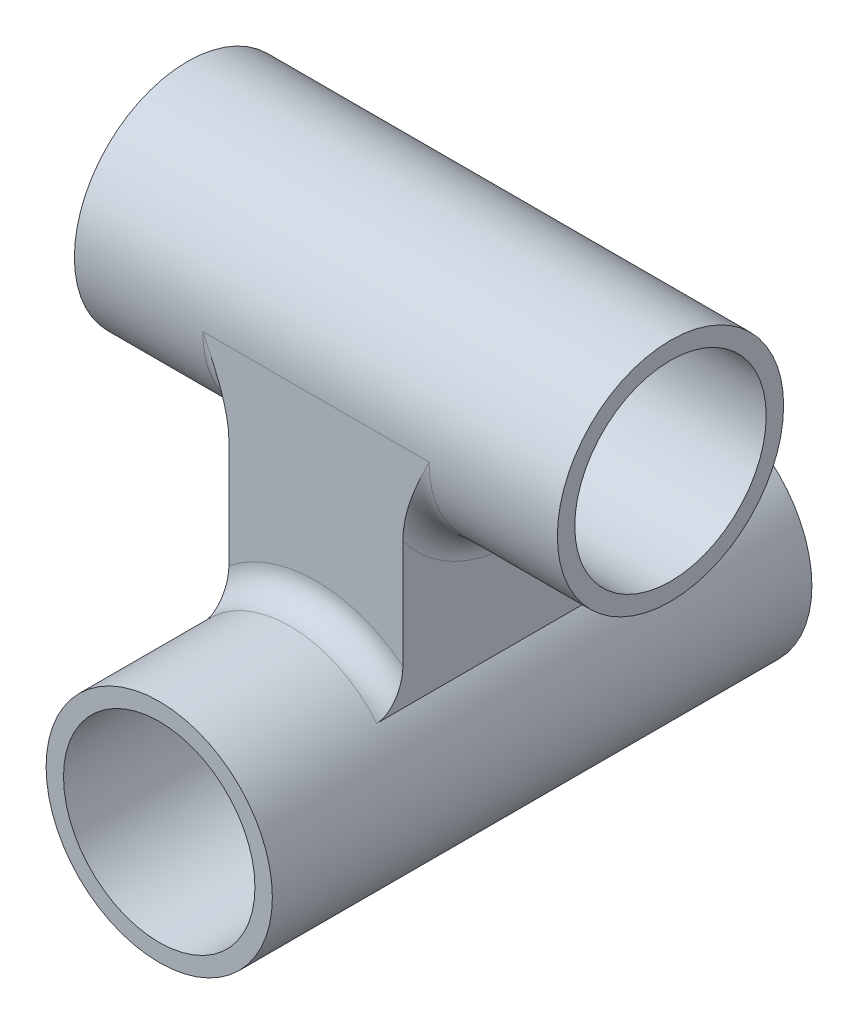
ISO-10303-21;
HEADER;
FILE_DESCRIPTION(('STEP AP214'),'2;1');
FILE_NAME('part.step','',(''),(''),'','','');
FILE_SCHEMA(('AUTOMOTIVE_DESIGN { 1 0 10303 214 1 1 1 1 }'));
ENDSEC;
DATA;
#1=APPLICATION_CONTEXT('core data for automotive mechanical design processes');
#2=APPLICATION_PROTOCOL_DEFINITION('international standard','automotive_design',2000,#1);
#3=PRODUCT_CONTEXT('',#1,'mechanical');
#4=PRODUCT('Part','Part','',(#3));
#5=PRODUCT_RELATED_PRODUCT_CATEGORY('part','',(#4));
#6=PRODUCT_DEFINITION_FORMATION('','',#4);
#7=PRODUCT_DEFINITION_CONTEXT('part definition',#1,'design');
#8=PRODUCT_DEFINITION('design','',#6,#7);
#9=PRODUCT_DEFINITION_SHAPE('','',#8);
#10=(LENGTH_UNIT() NAMED_UNIT(*) SI_UNIT(.MILLI.,.METRE.));
#11=(NAMED_UNIT(*) PLANE_ANGLE_UNIT() SI_UNIT($,.RADIAN.));
#12=(NAMED_UNIT(*) SI_UNIT($,.STERADIAN.) SOLID_ANGLE_UNIT());
#13=UNCERTAINTY_MEASURE_WITH_UNIT(LENGTH_MEASURE(1.E-05),#10,'distance_accuracy_value','');
#14=(GEOMETRIC_REPRESENTATION_CONTEXT(3) GLOBAL_UNCERTAINTY_ASSIGNED_CONTEXT((#13)) GLOBAL_UNIT_ASSIGNED_CONTEXT((#10,
#11,#12)) REPRESENTATION_CONTEXT('',''));
#15=CARTESIAN_POINT('',(0.,0.,0.));
#16=DIRECTION('',(0.,0.,1.));
#17=DIRECTION('',(1.,0.,0.));
#18=AXIS2_PLACEMENT_3D('',#15,#16,#17);
#19=CARTESIAN_POINT('',(0.,0.,31.));
#20=DIRECTION('',(0.,0.,1.));
#21=DIRECTION('',(1.,0.,0.));
#22=AXIS2_PLACEMENT_3D('',#19,#20,#21);
#23=PLANE('',#22);
#24=CARTESIAN_POINT('',(0.,0.,31.));
#25=DIRECTION('',(0.,0.,1.));
#26=DIRECTION('',(1.,0.,0.));
#27=AXIS2_PLACEMENT_3D('',#24,#25,#26);
#28=CIRCLE('',#27,13.);
#29=CARTESIAN_POINT('',(13.,0.,31.));
#30=VERTEX_POINT('',#29);
#31=EDGE_CURVE('E132',#30,#30,#28,.T.);
#32=ORIENTED_EDGE('',*,*,#31,.T.);
#33=EDGE_LOOP('',(#32));
#34=FACE_BOUND('',#33,.T.);
#35=CARTESIAN_POINT('',(0.,0.,31.));
#36=DIRECTION('',(0.,0.,1.));
#37=DIRECTION('',(1.,0.,0.));
#38=AXIS2_PLACEMENT_3D('',#35,#36,#37);
#39=CIRCLE('',#38,11.);
#40=CARTESIAN_POINT('',(11.,0.,31.));
#41=VERTEX_POINT('',#40);
#42=EDGE_CURVE('E227',#41,#41,#39,.T.);
#43=ORIENTED_EDGE('',*,*,#42,.F.);
#44=EDGE_LOOP('',(#43));
#45=FACE_BOUND('',#44,.T.);
#46=ADVANCED_FACE('F39',(#34,#45),#23,.T.);
#47=CARTESIAN_POINT('',(0.,0.,-31.));
#48=DIRECTION('',(0.,0.,1.));
#49=DIRECTION('',(1.,0.,0.));
#50=AXIS2_PLACEMENT_3D('',#47,#48,#49);
#51=PLANE('',#50);
#52=CARTESIAN_POINT('',(0.,0.,-31.));
#53=DIRECTION('',(0.,0.,1.));
#54=DIRECTION('',(1.,0.,0.));
#55=AXIS2_PLACEMENT_3D('',#52,#53,#54);
#56=CIRCLE('',#55,13.);
#57=CARTESIAN_POINT('',(13.,0.,-31.));
#58=VERTEX_POINT('',#57);
#59=EDGE_CURVE('E233',#58,#58,#56,.T.);
#60=ORIENTED_EDGE('',*,*,#59,.F.);
#61=EDGE_LOOP('',(#60));
#62=FACE_BOUND('',#61,.T.);
#63=CARTESIAN_POINT('',(0.,0.,-31.));
#64=DIRECTION('',(0.,0.,1.));
#65=DIRECTION('',(1.,0.,0.));
#66=AXIS2_PLACEMENT_3D('',#63,#64,#65);
#67=CIRCLE('',#66,11.);
#68=CARTESIAN_POINT('',(11.,0.,-31.));
#69=VERTEX_POINT('',#68);
#70=EDGE_CURVE('E230',#69,#69,#67,.T.);
#71=ORIENTED_EDGE('',*,*,#70,.T.);
#72=EDGE_LOOP('',(#71));
#73=FACE_BOUND('',#72,.T.);
#74=ADVANCED_FACE('F202',(#62,#73),#51,.F.);
#75=CARTESIAN_POINT('',(0.,0.,31.));
#76=DIRECTION('',(0.,0.,-1.));
#77=DIRECTION('',(-1.,0.,0.));
#78=AXIS2_PLACEMENT_3D('',#75,#76,#77);
#79=CYLINDRICAL_SURFACE('',#78,13.);
#80=CARTESIAN_POINT('',(0.,0.,-16.));
#81=DIRECTION('',(0.,0.,1.));
#82=DIRECTION('',(1.,0.,0.));
#83=AXIS2_PLACEMENT_3D('',#80,#81,#82);
#84=CIRCLE('',#83,13.);
#85=CARTESIAN_POINT('',(-10.,8.30662386291807,-16.));
#86=VERTEX_POINT('',#85);
#87=CARTESIAN_POINT('',(10.,8.30662386291807,-16.));
#88=VERTEX_POINT('',#87);
#89=EDGE_CURVE('E131',#86,#88,#84,.F.);
#90=ORIENTED_EDGE('',*,*,#89,.T.);
#91=DIRECTION('',(0.,0.,-1.));
#92=VECTOR('',#91,1.);
#93=CARTESIAN_POINT('',(10.,8.30662386291807,13.));
#94=LINE('',#93,#92);
#95=CARTESIAN_POINT('',(10.,8.30662386291807,16.));
#96=VERTEX_POINT('',#95);
#97=EDGE_CURVE('E122',#96,#88,#94,.T.);
#98=ORIENTED_EDGE('',*,*,#97,.F.);
#99=CARTESIAN_POINT('',(0.,0.,16.));
#100=DIRECTION('',(0.,0.,1.));
#101=DIRECTION('',(1.,0.,0.));
#102=AXIS2_PLACEMENT_3D('',#99,#100,#101);
#103=CIRCLE('',#102,13.);
#104=CARTESIAN_POINT('',(-10.,8.30662386291807,16.));
#105=VERTEX_POINT('',#104);
#106=EDGE_CURVE('E126',#96,#105,#103,.T.);
#107=ORIENTED_EDGE('',*,*,#106,.T.);
#108=DIRECTION('',(0.,0.,-1.));
#109=VECTOR('',#108,1.);
#110=CARTESIAN_POINT('',(-10.,8.30662386291807,13.));
#111=LINE('',#110,#109);
#112=EDGE_CURVE('E109',#105,#86,#111,.T.);
#113=ORIENTED_EDGE('',*,*,#112,.T.);
#114=EDGE_LOOP('',(#90,#98,#107,#113));
#115=FACE_BOUND('',#114,.T.);
#116=ORIENTED_EDGE('',*,*,#31,.F.);
#117=EDGE_LOOP('',(#116));
#118=FACE_BOUND('',#117,.T.);
#119=ORIENTED_EDGE('',*,*,#59,.T.);
#120=EDGE_LOOP('',(#119));
#121=FACE_BOUND('',#120,.T.);
#122=ADVANCED_FACE('F127',(#115,#118,#121),#79,.T.);
#123=CARTESIAN_POINT('',(0.,0.,31.));
#124=DIRECTION('',(0.,0.,-1.));
#125=DIRECTION('',(-1.,0.,0.));
#126=AXIS2_PLACEMENT_3D('',#123,#124,#125);
#127=CYLINDRICAL_SURFACE('',#126,11.);
#128=ORIENTED_EDGE('',*,*,#42,.T.);
#129=EDGE_LOOP('',(#128));
#130=FACE_BOUND('',#129,.T.);
#131=ORIENTED_EDGE('',*,*,#70,.F.);
#132=EDGE_LOOP('',(#131));
#133=FACE_BOUND('',#132,.T.);
#134=ADVANCED_FACE('F213',(#130,#133),#127,.F.);
#135=CARTESIAN_POINT('',(10.,8.30662386291807,13.));
#136=DIRECTION('',(-1.,0.,0.));
#137=DIRECTION('',(0.,0.,1.));
#138=AXIS2_PLACEMENT_3D('',#135,#136,#137);
#139=PLANE('',#138);
#140=DIRECTION('',(0.,1.,0.));
#141=VECTOR('',#140,1.);
#142=CARTESIAN_POINT('',(10.,8.30662386291807,-13.));
#143=LINE('',#142,#141);
#144=CARTESIAN_POINT('',(10.,12.4899959967968,-13.));
#145=VERTEX_POINT('',#144);
#146=CARTESIAN_POINT('',(10.,24.9792448098293,-13.));
#147=VERTEX_POINT('',#146);
#148=EDGE_CURVE('E269',#145,#147,#143,.T.);
#149=ORIENTED_EDGE('',*,*,#148,.T.);
#150=CARTESIAN_POINT('',(10.,34.3066238629181,0.));
#151=DIRECTION('',(-1.,0.,0.));
#152=DIRECTION('',(0.,0.,1.));
#153=AXIS2_PLACEMENT_3D('',#150,#151,#152);
#154=CIRCLE('',#153,16.);
#155=CARTESIAN_POINT('',(10.,24.9792448098293,13.));
#156=VERTEX_POINT('',#155);
#157=EDGE_CURVE('E252',#147,#156,#154,.T.);
#158=ORIENTED_EDGE('',*,*,#157,.T.);
#159=DIRECTION('',(0.,1.,0.));
#160=VECTOR('',#159,1.);
#161=CARTESIAN_POINT('',(10.,8.30662386291807,13.));
#162=LINE('',#161,#160);
#163=CARTESIAN_POINT('',(10.,12.4899959967968,13.));
#164=VERTEX_POINT('',#163);
#165=EDGE_CURVE('E305',#164,#156,#162,.T.);
#166=ORIENTED_EDGE('',*,*,#165,.F.);
#167=CARTESIAN_POINT('',(10.,12.4899959967968,13.));
#168=CARTESIAN_POINT('',(10.,12.3635305072587,13.000008460085));
#169=CARTESIAN_POINT('',(10.,12.2370869478931,13.0048730253736));
#170=CARTESIAN_POINT('',(10.,11.9849450710262,13.0240193173672));
#171=CARTESIAN_POINT('',(10.,11.8592465673436,13.0382985818873));
#172=CARTESIAN_POINT('',(10.,11.6083760404319,13.0761081414322));
#173=CARTESIAN_POINT('',(10.,11.4832134680354,13.0997009196541));
#174=CARTESIAN_POINT('',(10.,11.2349185572668,13.155911915837));
#175=CARTESIAN_POINT('',(10.,11.1117864935054,13.1885313441471));
#176=CARTESIAN_POINT('',(10.,10.8510274412971,13.2678716909599));
#177=CARTESIAN_POINT('',(10.,10.7138055871928,13.3159326380406));
#178=CARTESIAN_POINT('',(10.,10.4438854764759,13.4235280956361));
#179=CARTESIAN_POINT('',(10.,10.3111884877645,13.4830657914298));
#180=CARTESIAN_POINT('',(10.,10.0518784691725,13.6135380451328));
#181=CARTESIAN_POINT('',(10.,9.92525198282513,13.6844457224775));
#182=CARTESIAN_POINT('',(10.,9.67939200814812,13.8379629665378));
#183=CARTESIAN_POINT('',(10.,9.56015342874513,13.9205643431285));
#184=CARTESIAN_POINT('',(10.,9.31240681177737,14.1123421336292));
#185=CARTESIAN_POINT('',(10.,9.18553011330381,14.223655888137));
#186=CARTESIAN_POINT('',(10.,8.94913693815627,14.4634593249828));
#187=CARTESIAN_POINT('',(10.,8.83959706389628,14.591925419208));
#188=CARTESIAN_POINT('',(10.,8.66657652854176,14.8354242881711));
#189=CARTESIAN_POINT('',(10.,8.59827599149694,14.9470040891866));
#190=CARTESIAN_POINT('',(10.,8.48063155375902,15.1795494276318));
#191=CARTESIAN_POINT('',(10.,8.43122815878752,15.3004840430228));
#192=CARTESIAN_POINT('',(10.,8.36522062311841,15.517770792605));
#193=CARTESIAN_POINT('',(10.,8.34346975155049,15.6125501079397));
#194=CARTESIAN_POINT('',(10.,8.32148047074597,15.7565975376567));
#195=CARTESIAN_POINT('',(10.,8.3159229976145,15.8050883552907));
#196=CARTESIAN_POINT('',(10.,8.30848961281239,15.9023803358274));
#197=CARTESIAN_POINT('',(10.,8.30661594319214,15.9511816696042));
#198=CARTESIAN_POINT('',(10.,8.30662386291807,16.));
#199=B_SPLINE_CURVE_WITH_KNOTS('',3,(#167,#168,#169,#170,#171,#172,#173,#174,#175,#176,#177,
#178,#179,#180,#181,#182,#183,#184,#185,#186,#187,#188,#189,#190,#191,#192,#193,#194,#195,#196,
#197,#198),.UNSPECIFIED.,.F.,.F.,(4,2,2,2,2,2,2,2,2,2,2,2,2,2,2,4),(0.,0.379271737736314,
0.758444325520817,1.14020518704317,1.52201726224596,1.95768239209769,2.39346861184106,
2.82823935070601,3.26270707424575,3.76761319809666,4.27183198623569,4.66292170527858,
5.05276981010725,5.34344276053081,5.48974072117135,5.63612769469873),.UNSPECIFIED.);
#200=EDGE_CURVE('E139',#164,#96,#199,.T.);
#201=ORIENTED_EDGE('',*,*,#200,.T.);
#202=ORIENTED_EDGE('',*,*,#97,.T.);
#203=CARTESIAN_POINT('',(10.,8.30662386291807,-16.));
#204=CARTESIAN_POINT('',(10.,8.30658833886969,-15.9347323725916));
#205=CARTESIAN_POINT('',(10.,8.30995593729337,-15.8694862288077));
#206=CARTESIAN_POINT('',(10.,8.32322059180652,-15.7397463602789));
#207=CARTESIAN_POINT('',(10.,8.33310886107564,-15.6752517416852));
#208=CARTESIAN_POINT('',(10.,8.35898486301592,-15.5483037774158));
#209=CARTESIAN_POINT('',(10.,8.37489876713847,-15.4858352861301));
#210=CARTESIAN_POINT('',(10.,8.41237545008858,-15.3626217868488));
#211=CARTESIAN_POINT('',(10.,8.43393978929203,-15.3018772600721));
#212=CARTESIAN_POINT('',(10.,8.50608473879607,-15.1234508266238));
#213=CARTESIAN_POINT('',(10.,8.56428759848339,-15.0087912835817));
#214=CARTESIAN_POINT('',(10.,8.69692062773018,-14.7890668517077));
#215=CARTESIAN_POINT('',(10.,8.77140572882401,-14.6840361930419));
#216=CARTESIAN_POINT('',(10.,8.97850133343871,-14.4276257083442));
#217=CARTESIAN_POINT('',(10.,9.12019339495249,-14.283536379677));
#218=CARTESIAN_POINT('',(10.,9.34803940291859,-14.0855004351729));
#219=CARTESIAN_POINT('',(10.,9.42667381912647,-14.0224207566723));
#220=CARTESIAN_POINT('',(10.,9.58829324073127,-13.9020998332437));
#221=CARTESIAN_POINT('',(10.,9.67127707189939,-13.8448570246801));
#222=CARTESIAN_POINT('',(10.,9.87272062149177,-13.7156582275456));
#223=CARTESIAN_POINT('',(10.,9.99280997458357,-13.646239017307));
#224=CARTESIAN_POINT('',(10.,10.2384715129593,-13.517926051586));
#225=CARTESIAN_POINT('',(10.,10.3640458239996,-13.4590364228141));
#226=CARTESIAN_POINT('',(10.,10.7472170190388,-13.2980469542637));
#227=CARTESIAN_POINT('',(10.,11.0115394870172,-13.2114528302501));
#228=CARTESIAN_POINT('',(10.,11.4789347528081,-13.0981074821472));
#229=CARTESIAN_POINT('',(10.,11.6797290076567,-13.0615882805379));
#230=CARTESIAN_POINT('',(10.,11.9827806630126,-13.0248091682262));
#231=CARTESIAN_POINT('',(10.,12.083978024326,-13.0155498004726));
#232=CARTESIAN_POINT('',(10.,12.2867749350851,-13.0031460840651));
#233=CARTESIAN_POINT('',(10.,12.3883745927901,-13.0000035119592));
#234=CARTESIAN_POINT('',(10.,12.4899959967968,-13.));
#235=B_SPLINE_CURVE_WITH_KNOTS('',3,(#203,#204,#205,#206,#207,#208,#209,#210,#211,#212,#213,
#214,#215,#216,#217,#218,#219,#220,#221,#222,#223,#224,#225,#226,#227,#228,#229,#230,#231,#232,
#233,#234),.UNSPECIFIED.,.F.,.F.,(4,2,2,2,2,2,2,2,2,2,2,2,2,2,2,4),(0.,0.195681446554637,
0.391099743230843,0.584197354457684,0.777348346172959,1.1612746100636,1.54651668863445,
2.14915059614874,2.45141027621394,2.75358877019722,3.16913184582677,3.58483742412144,
4.41527844334981,5.02620512378388,5.33089429985237,5.63567195594355),.UNSPECIFIED.);
#236=EDGE_CURVE('E256',#88,#145,#235,.T.);
#237=ORIENTED_EDGE('',*,*,#236,.T.);
#238=EDGE_LOOP('',(#149,#158,#166,#201,#202,#237));
#239=FACE_BOUND('',#238,.T.);
#240=ADVANCED_FACE('F218',(#239),#139,.F.);
#241=CARTESIAN_POINT('',(-10.,8.30662386291807,13.));
#242=DIRECTION('',(1.,0.,0.));
#243=DIRECTION('',(0.,0.,-1.));
#244=AXIS2_PLACEMENT_3D('',#241,#242,#243);
#245=PLANE('',#244);
#246=DIRECTION('',(0.,-1.,0.));
#247=VECTOR('',#246,1.);
#248=CARTESIAN_POINT('',(-10.,8.30662386291807,13.));
#249=LINE('',#248,#247);
#250=CARTESIAN_POINT('',(-10.,24.9792448098293,13.));
#251=VERTEX_POINT('',#250);
#252=CARTESIAN_POINT('',(-10.,12.4899959967968,13.));
#253=VERTEX_POINT('',#252);
#254=EDGE_CURVE('E123',#251,#253,#249,.T.);
#255=ORIENTED_EDGE('',*,*,#254,.F.);
#256=CARTESIAN_POINT('',(-10.,34.3066238629181,0.));
#257=DIRECTION('',(1.,0.,0.));
#258=DIRECTION('',(0.,0.,-1.));
#259=AXIS2_PLACEMENT_3D('',#256,#257,#258);
#260=CIRCLE('',#259,16.);
#261=CARTESIAN_POINT('',(-10.,24.9792448098293,-13.));
#262=VERTEX_POINT('',#261);
#263=EDGE_CURVE('E254',#251,#262,#260,.T.);
#264=ORIENTED_EDGE('',*,*,#263,.T.);
#265=DIRECTION('',(0.,-1.,0.));
#266=VECTOR('',#265,1.);
#267=CARTESIAN_POINT('',(-10.,8.30662386291807,-13.));
#268=LINE('',#267,#266);
#269=CARTESIAN_POINT('',(-10.,12.4899959967968,-13.));
#270=VERTEX_POINT('',#269);
#271=EDGE_CURVE('E308',#262,#270,#268,.T.);
#272=ORIENTED_EDGE('',*,*,#271,.T.);
#273=CARTESIAN_POINT('',(-10.,12.4899959967968,-13.));
#274=CARTESIAN_POINT('',(-10.,12.3635305072587,-13.000008460085));
#275=CARTESIAN_POINT('',(-10.,12.2370869478931,-13.0048730253736));
#276=CARTESIAN_POINT('',(-10.,11.9849450710262,-13.0240193173672));
#277=CARTESIAN_POINT('',(-10.,11.8592465673436,-13.0382985818873));
#278=CARTESIAN_POINT('',(-10.,11.6083760404319,-13.0761081414322));
#279=CARTESIAN_POINT('',(-10.,11.4832134680354,-13.0997009196541));
#280=CARTESIAN_POINT('',(-10.,11.2349185572668,-13.155911915837));
#281=CARTESIAN_POINT('',(-10.,11.1117864935054,-13.1885313441471));
#282=CARTESIAN_POINT('',(-10.,10.8510274412971,-13.2678716909599));
#283=CARTESIAN_POINT('',(-10.,10.7138055871928,-13.3159326380406));
#284=CARTESIAN_POINT('',(-10.,10.4438854764759,-13.4235280956361));
#285=CARTESIAN_POINT('',(-10.,10.3111884877645,-13.4830657914298));
#286=CARTESIAN_POINT('',(-10.,10.0518784691725,-13.6135380451328));
#287=CARTESIAN_POINT('',(-10.,9.92525198282513,-13.6844457224775));
#288=CARTESIAN_POINT('',(-10.,9.67939200814812,-13.8379629665378));
#289=CARTESIAN_POINT('',(-10.,9.56015342874513,-13.9205643431285));
#290=CARTESIAN_POINT('',(-10.,9.31240681177737,-14.1123421336292));
#291=CARTESIAN_POINT('',(-10.,9.18553011330381,-14.223655888137));
#292=CARTESIAN_POINT('',(-10.,8.94913693815627,-14.4634593249828));
#293=CARTESIAN_POINT('',(-10.,8.83959706389628,-14.591925419208));
#294=CARTESIAN_POINT('',(-10.,8.66657652854176,-14.8354242881711));
#295=CARTESIAN_POINT('',(-10.,8.59827599149694,-14.9470040891866));
#296=CARTESIAN_POINT('',(-10.,8.48063155375902,-15.1795494276318));
#297=CARTESIAN_POINT('',(-10.,8.43122815878752,-15.3004840430228));
#298=CARTESIAN_POINT('',(-10.,8.36522062311841,-15.517770792605));
#299=CARTESIAN_POINT('',(-10.,8.34346975155049,-15.6125501079397));
#300=CARTESIAN_POINT('',(-10.,8.32148047074597,-15.7565975376567));
#301=CARTESIAN_POINT('',(-10.,8.3159229976145,-15.8050883552907));
#302=CARTESIAN_POINT('',(-10.,8.30848961281239,-15.9023803358274));
#303=CARTESIAN_POINT('',(-10.,8.30661594319214,-15.9511816696042));
#304=CARTESIAN_POINT('',(-10.,8.30662386291807,-16.));
#305=B_SPLINE_CURVE_WITH_KNOTS('',3,(#273,#274,#275,#276,#277,#278,#279,#280,#281,#282,#283,
#284,#285,#286,#287,#288,#289,#290,#291,#292,#293,#294,#295,#296,#297,#298,#299,#300,#301,#302,
#303,#304),.UNSPECIFIED.,.F.,.F.,(4,2,2,2,2,2,2,2,2,2,2,2,2,2,2,4),(0.,0.379271737736314,
0.758444325520817,1.14020518704317,1.52201726224596,1.95768239209769,2.39346861184106,
2.82823935070601,3.26270707424575,3.76761319809666,4.27183198623569,4.66292170527858,
5.05276981010725,5.34344276053081,5.48974072117135,5.63612769469873),.UNSPECIFIED.);
#306=EDGE_CURVE('E118',#270,#86,#305,.T.);
#307=ORIENTED_EDGE('',*,*,#306,.T.);
#308=ORIENTED_EDGE('',*,*,#112,.F.);
#309=CARTESIAN_POINT('',(-10.,8.30662386291807,16.));
#310=CARTESIAN_POINT('',(-10.,8.30658833886969,15.9347323725916));
#311=CARTESIAN_POINT('',(-10.,8.30995593729337,15.8694862288077));
#312=CARTESIAN_POINT('',(-10.,8.32322059180652,15.7397463602789));
#313=CARTESIAN_POINT('',(-10.,8.33310886107564,15.6752517416852));
#314=CARTESIAN_POINT('',(-10.,8.35898486301592,15.5483037774158));
#315=CARTESIAN_POINT('',(-10.,8.37489876713847,15.4858352861301));
#316=CARTESIAN_POINT('',(-10.,8.41237545008858,15.3626217868488));
#317=CARTESIAN_POINT('',(-10.,8.43393978929203,15.3018772600721));
#318=CARTESIAN_POINT('',(-10.,8.50608473879607,15.1234508266238));
#319=CARTESIAN_POINT('',(-10.,8.56428759848339,15.0087912835817));
#320=CARTESIAN_POINT('',(-10.,8.69692062773018,14.7890668517077));
#321=CARTESIAN_POINT('',(-10.,8.77140572882401,14.6840361930419));
#322=CARTESIAN_POINT('',(-10.,8.97850133343871,14.4276257083442));
#323=CARTESIAN_POINT('',(-10.,9.12019339495249,14.283536379677));
#324=CARTESIAN_POINT('',(-10.,9.34803940291859,14.0855004351729));
#325=CARTESIAN_POINT('',(-10.,9.42667381912647,14.0224207566723));
#326=CARTESIAN_POINT('',(-10.,9.58829324073127,13.9020998332437));
#327=CARTESIAN_POINT('',(-10.,9.67127707189939,13.8448570246801));
#328=CARTESIAN_POINT('',(-10.,9.87272062149177,13.7156582275456));
#329=CARTESIAN_POINT('',(-10.,9.99280997458357,13.646239017307));
#330=CARTESIAN_POINT('',(-10.,10.2384715129593,13.517926051586));
#331=CARTESIAN_POINT('',(-10.,10.3640458239996,13.4590364228141));
#332=CARTESIAN_POINT('',(-10.,10.7472170190388,13.2980469542637));
#333=CARTESIAN_POINT('',(-10.,11.0115394870172,13.2114528302501));
#334=CARTESIAN_POINT('',(-10.,11.4789347528081,13.0981074821472));
#335=CARTESIAN_POINT('',(-10.,11.6797290076567,13.0615882805379));
#336=CARTESIAN_POINT('',(-10.,11.9827806630126,13.0248091682262));
#337=CARTESIAN_POINT('',(-10.,12.083978024326,13.0155498004726));
#338=CARTESIAN_POINT('',(-10.,12.2867749350851,13.0031460840651));
#339=CARTESIAN_POINT('',(-10.,12.3883745927901,13.0000035119592));
#340=CARTESIAN_POINT('',(-10.,12.4899959967968,13.));
#341=B_SPLINE_CURVE_WITH_KNOTS('',3,(#309,#310,#311,#312,#313,#314,#315,#316,#317,#318,#319,
#320,#321,#322,#323,#324,#325,#326,#327,#328,#329,#330,#331,#332,#333,#334,#335,#336,#337,#338,
#339,#340),.UNSPECIFIED.,.F.,.F.,(4,2,2,2,2,2,2,2,2,2,2,2,2,2,2,4),(0.,0.195681446554637,
0.391099743230843,0.584197354457684,0.777348346172959,1.1612746100636,1.54651668863445,
2.14915059614874,2.45141027621394,2.75358877019722,3.16913184582677,3.58483742412144,
4.41527844334981,5.02620512378388,5.33089429985237,5.63567195594355),.UNSPECIFIED.);
#342=EDGE_CURVE('E114',#105,#253,#341,.T.);
#343=ORIENTED_EDGE('',*,*,#342,.T.);
#344=EDGE_LOOP('',(#255,#264,#272,#307,#308,#343));
#345=FACE_BOUND('',#344,.T.);
#346=ADVANCED_FACE('F112',(#345),#245,.F.);
#347=CARTESIAN_POINT('',(0.,0.,13.));
#348=DIRECTION('',(0.,0.,1.));
#349=DIRECTION('',(1.,0.,0.));
#350=AXIS2_PLACEMENT_3D('',#347,#348,#349);
#351=PLANE('',#350);
#352=ORIENTED_EDGE('',*,*,#254,.T.);
#353=CARTESIAN_POINT('',(0.,0.,13.));
#354=DIRECTION('',(0.,0.,1.));
#355=DIRECTION('',(1.,0.,0.));
#356=AXIS2_PLACEMENT_3D('',#353,#354,#355);
#357=CIRCLE('',#356,16.);
#358=EDGE_CURVE('E137',#253,#164,#357,.F.);
#359=ORIENTED_EDGE('',*,*,#358,.T.);
#360=ORIENTED_EDGE('',*,*,#165,.T.);
#361=CARTESIAN_POINT('',(10.,24.9792448098293,13.));
#362=CARTESIAN_POINT('',(10.0000178950717,25.1470323929574,13.));
#363=CARTESIAN_POINT('',(10.0047825857562,25.3147685219532,13.));
#364=CARTESIAN_POINT('',(10.0229108107802,25.6496860465647,13.));
#365=CARTESIAN_POINT('',(10.0362693922074,25.8168677059885,13.));
#366=CARTESIAN_POINT('',(10.0706426297228,26.1499331302336,13.));
#367=CARTESIAN_POINT('',(10.0916348904289,26.3158192563467,13.));
#368=CARTESIAN_POINT('',(10.1405186029594,26.6465851355249,13.));
#369=CARTESIAN_POINT('',(10.1684111483489,26.8114647248248,13.));
#370=CARTESIAN_POINT('',(10.2606057350329,27.3002625607845,13.));
#371=CARTESIAN_POINT('',(10.3338915744748,27.6225038502651,13.));
#372=CARTESIAN_POINT('',(10.4999960757676,28.2620694141597,13.));
#373=CARTESIAN_POINT('',(10.5928313792849,28.579389250459,13.));
#374=CARTESIAN_POINT('',(10.8420153659898,29.3589570574801,13.));
#375=CARTESIAN_POINT('',(11.0075551139598,29.8182492102551,13.));
#376=CARTESIAN_POINT('',(11.3621419455965,30.7274677485777,13.));
#377=CARTESIAN_POINT('',(11.5511904075641,31.1773935831769,13.));
#378=CARTESIAN_POINT('',(12.1419517844386,32.5203789228433,13.));
#379=CARTESIAN_POINT('',(12.5660972382915,33.4033826714976,12.9999999999999));
#380=CARTESIAN_POINT('',(12.9934172147401,34.2929206725283,13.));
#381=CARTESIAN_POINT('',(12.9967086178967,34.2997722742305,13.));
#382=CARTESIAN_POINT('',(13.,34.3066238629181,13.));
#383=B_SPLINE_CURVE_WITH_KNOTS('',3,(#361,#362,#363,#364,#365,#366,#367,#368,#369,#370,#371,
#372,#373,#374,#375,#376,#377,#378,#379,#380,#381,#382),.UNSPECIFIED.,.F.,.F.,(4,2,2,2,2,2,2,2,
2,2,4),(0.,0.503221312486387,1.00615286322327,1.5076206826587,2.00916802626999,2.99972708135892,
3.99113279276112,5.45472849878846,6.91841005499088,9.85615966079158,9.87896316929401),.UNSPECIFIED.);
#384=CARTESIAN_POINT('',(13.,34.3066238629181,13.));
#385=VERTEX_POINT('',#384);
#386=EDGE_CURVE('E141',#156,#385,#383,.T.);
#387=ORIENTED_EDGE('',*,*,#386,.T.);
#388=DIRECTION('',(-1.,0.,0.));
#389=VECTOR('',#388,1.);
#390=CARTESIAN_POINT('',(-10.,34.3066238629181,13.));
#391=LINE('',#390,#389);
#392=CARTESIAN_POINT('',(-13.,34.3066238629181,13.));
#393=VERTEX_POINT('',#392);
#394=EDGE_CURVE('E67',#385,#393,#391,.T.);
#395=ORIENTED_EDGE('',*,*,#394,.T.);
#396=CARTESIAN_POINT('',(-10.,24.9792448098293,13.));
#397=CARTESIAN_POINT('',(-10.0000178950717,25.1470323929574,13.));
#398=CARTESIAN_POINT('',(-10.0047825857562,25.3147685219533,13.));
#399=CARTESIAN_POINT('',(-10.0229108107802,25.6496860465648,13.));
#400=CARTESIAN_POINT('',(-10.0362693922074,25.8168677059886,13.));
#401=CARTESIAN_POINT('',(-10.0706426297229,26.1499331302338,13.));
#402=CARTESIAN_POINT('',(-10.091634890429,26.315819256347,13.));
#403=CARTESIAN_POINT('',(-10.1405186029594,26.6465851355252,13.));
#404=CARTESIAN_POINT('',(-10.168411148349,26.8114647248251,13.));
#405=CARTESIAN_POINT('',(-10.260605735033,27.3002625607848,13.));
#406=CARTESIAN_POINT('',(-10.3338915744749,27.6225038502653,13.));
#407=CARTESIAN_POINT('',(-10.4999960757676,28.2620694141598,13.));
#408=CARTESIAN_POINT('',(-10.5928313792849,28.5793892504591,13.));
#409=CARTESIAN_POINT('',(-10.8420153659898,29.3589570574801,13.));
#410=CARTESIAN_POINT('',(-11.0075551139598,29.8182492102551,13.));
#411=CARTESIAN_POINT('',(-11.3621419455964,30.7274677485777,13.));
#412=CARTESIAN_POINT('',(-11.5511904075639,31.1773935831769,13.));
#413=CARTESIAN_POINT('',(-12.141951784439,32.520378922843,13.));
#414=CARTESIAN_POINT('',(-12.5660972382936,33.4033826714966,12.9999999999999));
#415=CARTESIAN_POINT('',(-12.9934172147401,34.2929206725283,13.));
#416=CARTESIAN_POINT('',(-12.9967086178967,34.2997722742305,13.));
#417=CARTESIAN_POINT('',(-13.,34.3066238629181,13.));
#418=B_SPLINE_CURVE_WITH_KNOTS('',3,(#396,#397,#398,#399,#400,#401,#402,#403,#404,#405,#406,
#407,#408,#409,#410,#411,#412,#413,#414,#415,#416,#417),.UNSPECIFIED.,.F.,.F.,(4,2,2,2,2,2,2,2,
2,2,4),(0.,0.503221312486474,1.00615286322345,1.50762068265896,2.00916802627032,
2.99972708135908,3.99113279276112,5.45472849878845,6.9184100549908,9.8561596607916,
9.87896316929401),.UNSPECIFIED.);
#419=EDGE_CURVE('E53',#393,#251,#418,.F.);
#420=ORIENTED_EDGE('',*,*,#419,.T.);
#421=EDGE_LOOP('',(#352,#359,#360,#387,#395,#420));
#422=FACE_BOUND('',#421,.T.);
#423=ADVANCED_FACE('F183',(#422),#351,.T.);
#424=CARTESIAN_POINT('',(0.,0.,-13.));
#425=DIRECTION('',(0.,0.,1.));
#426=DIRECTION('',(1.,0.,0.));
#427=AXIS2_PLACEMENT_3D('',#424,#425,#426);
#428=PLANE('',#427);
#429=ORIENTED_EDGE('',*,*,#148,.F.);
#430=CARTESIAN_POINT('',(0.,0.,-13.));
#431=DIRECTION('',(0.,0.,1.));
#432=DIRECTION('',(1.,0.,0.));
#433=AXIS2_PLACEMENT_3D('',#430,#431,#432);
#434=CIRCLE('',#433,16.);
#435=EDGE_CURVE('E245',#145,#270,#434,.T.);
#436=ORIENTED_EDGE('',*,*,#435,.T.);
#437=ORIENTED_EDGE('',*,*,#271,.F.);
#438=CARTESIAN_POINT('',(-10.,24.9792448098293,-13.));
#439=CARTESIAN_POINT('',(-10.0000178950717,25.1470323929574,-13.));
#440=CARTESIAN_POINT('',(-10.0047825857562,25.3147685219533,-13.));
#441=CARTESIAN_POINT('',(-10.0229108107802,25.6496860465648,-13.));
#442=CARTESIAN_POINT('',(-10.0362693922074,25.8168677059886,-13.));
#443=CARTESIAN_POINT('',(-10.0706426297229,26.1499331302338,-13.));
#444=CARTESIAN_POINT('',(-10.091634890429,26.315819256347,-13.));
#445=CARTESIAN_POINT('',(-10.1405186029594,26.6465851355252,-13.));
#446=CARTESIAN_POINT('',(-10.168411148349,26.8114647248251,-13.));
#447=CARTESIAN_POINT('',(-10.260605735033,27.3002625607848,-13.));
#448=CARTESIAN_POINT('',(-10.3338915744749,27.6225038502653,-13.));
#449=CARTESIAN_POINT('',(-10.4999960757676,28.2620694141598,-13.));
#450=CARTESIAN_POINT('',(-10.5928313792849,28.5793892504591,-13.));
#451=CARTESIAN_POINT('',(-10.8420153659898,29.3589570574801,-13.));
#452=CARTESIAN_POINT('',(-11.0075551139598,29.8182492102551,-13.));
#453=CARTESIAN_POINT('',(-11.3621419455964,30.7274677485777,-13.));
#454=CARTESIAN_POINT('',(-11.5511904075639,31.1773935831769,-13.));
#455=CARTESIAN_POINT('',(-12.141951784439,32.520378922843,-13.));
#456=CARTESIAN_POINT('',(-12.5660972382936,33.4033826714966,-12.9999999999999));
#457=CARTESIAN_POINT('',(-12.9934172147401,34.2929206725283,-13.));
#458=CARTESIAN_POINT('',(-12.9967086178967,34.2997722742305,-13.));
#459=CARTESIAN_POINT('',(-13.,34.3066238629181,-13.));
#460=B_SPLINE_CURVE_WITH_KNOTS('',3,(#438,#439,#440,#441,#442,#443,#444,#445,#446,#447,#448,
#449,#450,#451,#452,#453,#454,#455,#456,#457,#458,#459),.UNSPECIFIED.,.F.,.F.,(4,2,2,2,2,2,2,2,
2,2,4),(0.,0.503221312486474,1.00615286322345,1.50762068265896,2.00916802627032,
2.99972708135908,3.99113279276112,5.45472849878845,6.9184100549908,9.8561596607916,
9.87896316929401),.UNSPECIFIED.);
#461=CARTESIAN_POINT('',(-13.,34.3066238629181,-13.));
#462=VERTEX_POINT('',#461);
#463=EDGE_CURVE('E11',#262,#462,#460,.T.);
#464=ORIENTED_EDGE('',*,*,#463,.T.);
#465=DIRECTION('',(-1.,0.,0.));
#466=VECTOR('',#465,1.);
#467=CARTESIAN_POINT('',(-10.,34.3066238629181,-13.));
#468=LINE('',#467,#466);
#469=CARTESIAN_POINT('',(13.,34.3066238629181,-13.));
#470=VERTEX_POINT('',#469);
#471=EDGE_CURVE('E59',#470,#462,#468,.T.);
#472=ORIENTED_EDGE('',*,*,#471,.F.);
#473=CARTESIAN_POINT('',(10.,24.9792448098293,-13.));
#474=CARTESIAN_POINT('',(10.0000178950717,25.1470323929574,-13.));
#475=CARTESIAN_POINT('',(10.0047825857562,25.3147685219532,-13.));
#476=CARTESIAN_POINT('',(10.0229108107802,25.6496860465647,-13.));
#477=CARTESIAN_POINT('',(10.0362693922074,25.8168677059885,-13.));
#478=CARTESIAN_POINT('',(10.0706426297228,26.1499331302336,-13.));
#479=CARTESIAN_POINT('',(10.0916348904289,26.3158192563467,-13.));
#480=CARTESIAN_POINT('',(10.1405186029594,26.6465851355249,-13.));
#481=CARTESIAN_POINT('',(10.1684111483489,26.8114647248248,-13.));
#482=CARTESIAN_POINT('',(10.2606057350329,27.3002625607845,-13.));
#483=CARTESIAN_POINT('',(10.3338915744748,27.6225038502651,-13.));
#484=CARTESIAN_POINT('',(10.4999960757676,28.2620694141597,-13.));
#485=CARTESIAN_POINT('',(10.5928313792849,28.579389250459,-13.));
#486=CARTESIAN_POINT('',(10.8420153659898,29.3589570574801,-13.));
#487=CARTESIAN_POINT('',(11.0075551139598,29.8182492102551,-13.));
#488=CARTESIAN_POINT('',(11.3621419455965,30.7274677485777,-13.));
#489=CARTESIAN_POINT('',(11.5511904075641,31.1773935831769,-13.));
#490=CARTESIAN_POINT('',(12.1419517844386,32.5203789228433,-13.));
#491=CARTESIAN_POINT('',(12.5660972382915,33.4033826714976,-12.9999999999999));
#492=CARTESIAN_POINT('',(12.9934172147401,34.2929206725283,-13.));
#493=CARTESIAN_POINT('',(12.9967086178967,34.2997722742305,-13.));
#494=CARTESIAN_POINT('',(13.,34.3066238629181,-13.));
#495=B_SPLINE_CURVE_WITH_KNOTS('',3,(#473,#474,#475,#476,#477,#478,#479,#480,#481,#482,#483,
#484,#485,#486,#487,#488,#489,#490,#491,#492,#493,#494),.UNSPECIFIED.,.F.,.F.,(4,2,2,2,2,2,2,2,
2,2,4),(0.,0.503221312486387,1.00615286322327,1.5076206826587,2.00916802626999,2.99972708135892,
3.99113279276112,5.45472849878846,6.91841005499088,9.85615966079158,9.87896316929401),.UNSPECIFIED.);
#496=EDGE_CURVE('E138',#470,#147,#495,.F.);
#497=ORIENTED_EDGE('',*,*,#496,.T.);
#498=EDGE_LOOP('',(#429,#436,#437,#464,#472,#497));
#499=FACE_BOUND('',#498,.T.);
#500=ADVANCED_FACE('F187',(#499),#428,.F.);
#501=CARTESIAN_POINT('',(27.75,34.3066238629181,0.));
#502=DIRECTION('',(-1.,0.,0.));
#503=DIRECTION('',(0.,0.,1.));
#504=AXIS2_PLACEMENT_3D('',#501,#502,#503);
#505=CYLINDRICAL_SURFACE('',#504,13.);
#506=CARTESIAN_POINT('',(27.75,34.3066238629181,0.));
#507=DIRECTION('',(1.,0.,0.));
#508=DIRECTION('',(0.,0.,-1.));
#509=AXIS2_PLACEMENT_3D('',#506,#507,#508);
#510=CIRCLE('',#509,13.);
#511=CARTESIAN_POINT('',(27.75,34.3066238629181,-13.));
#512=VERTEX_POINT('',#511);
#513=EDGE_CURVE('E274',#512,#512,#510,.T.);
#514=ORIENTED_EDGE('',*,*,#513,.F.);
#515=EDGE_LOOP('',(#514));
#516=FACE_BOUND('',#515,.T.);
#517=CARTESIAN_POINT('',(-27.75,34.3066238629181,0.));
#518=DIRECTION('',(1.,0.,0.));
#519=DIRECTION('',(0.,0.,-1.));
#520=AXIS2_PLACEMENT_3D('',#517,#518,#519);
#521=CIRCLE('',#520,13.);
#522=CARTESIAN_POINT('',(-27.75,34.3066238629181,-13.));
#523=VERTEX_POINT('',#522);
#524=EDGE_CURVE('E299',#523,#523,#521,.T.);
#525=ORIENTED_EDGE('',*,*,#524,.T.);
#526=EDGE_LOOP('',(#525));
#527=FACE_BOUND('',#526,.T.);
#528=CARTESIAN_POINT('',(13.,34.3066238629181,0.));
#529=DIRECTION('',(-1.,0.,0.));
#530=DIRECTION('',(0.,0.,1.));
#531=AXIS2_PLACEMENT_3D('',#528,#529,#530);
#532=CIRCLE('',#531,13.);
#533=EDGE_CURVE('E250',#385,#470,#532,.F.);
#534=ORIENTED_EDGE('',*,*,#533,.T.);
#535=ORIENTED_EDGE('',*,*,#471,.T.);
#536=CARTESIAN_POINT('',(-13.,34.3066238629181,0.));
#537=DIRECTION('',(1.,0.,0.));
#538=DIRECTION('',(0.,0.,-1.));
#539=AXIS2_PLACEMENT_3D('',#536,#537,#538);
#540=CIRCLE('',#539,13.);
#541=EDGE_CURVE('E248',#462,#393,#540,.F.);
#542=ORIENTED_EDGE('',*,*,#541,.T.);
#543=ORIENTED_EDGE('',*,*,#394,.F.);
#544=EDGE_LOOP('',(#534,#535,#542,#543));
#545=FACE_BOUND('',#544,.T.);
#546=ADVANCED_FACE('F189',(#516,#527,#545),#505,.T.);
#547=CARTESIAN_POINT('',(27.75,34.3066238629181,0.));
#548=DIRECTION('',(1.,0.,0.));
#549=DIRECTION('',(0.,0.,-1.));
#550=AXIS2_PLACEMENT_3D('',#547,#548,#549);
#551=PLANE('',#550);
#552=CARTESIAN_POINT('',(27.75,34.3066238629181,0.));
#553=DIRECTION('',(1.,0.,0.));
#554=DIRECTION('',(0.,0.,-1.));
#555=AXIS2_PLACEMENT_3D('',#552,#553,#554);
#556=CIRCLE('',#555,11.);
#557=CARTESIAN_POINT('',(27.75,34.3066238629181,-11.));
#558=VERTEX_POINT('',#557);
#559=EDGE_CURVE('E242',#558,#558,#556,.T.);
#560=ORIENTED_EDGE('',*,*,#559,.F.);
#561=EDGE_LOOP('',(#560));
#562=FACE_BOUND('',#561,.T.);
#563=ORIENTED_EDGE('',*,*,#513,.T.);
#564=EDGE_LOOP('',(#563));
#565=FACE_BOUND('',#564,.T.);
#566=ADVANCED_FACE('F198',(#562,#565),#551,.T.);
#567=CARTESIAN_POINT('',(-27.75,34.3066238629181,0.));
#568=DIRECTION('',(1.,0.,0.));
#569=DIRECTION('',(0.,0.,-1.));
#570=AXIS2_PLACEMENT_3D('',#567,#568,#569);
#571=PLANE('',#570);
#572=CARTESIAN_POINT('',(-27.75,34.3066238629181,0.));
#573=DIRECTION('',(1.,0.,0.));
#574=DIRECTION('',(0.,0.,-1.));
#575=AXIS2_PLACEMENT_3D('',#572,#573,#574);
#576=CIRCLE('',#575,11.);
#577=CARTESIAN_POINT('',(-27.75,34.3066238629181,-11.));
#578=VERTEX_POINT('',#577);
#579=EDGE_CURVE('E240',#578,#578,#576,.T.);
#580=ORIENTED_EDGE('',*,*,#579,.T.);
#581=EDGE_LOOP('',(#580));
#582=FACE_BOUND('',#581,.T.);
#583=ORIENTED_EDGE('',*,*,#524,.F.);
#584=EDGE_LOOP('',(#583));
#585=FACE_BOUND('',#584,.T.);
#586=ADVANCED_FACE('F281',(#582,#585),#571,.F.);
#587=CARTESIAN_POINT('',(-62.25,34.3066238629181,0.));
#588=DIRECTION('',(1.,0.,0.));
#589=DIRECTION('',(0.,0.,-1.));
#590=AXIS2_PLACEMENT_3D('',#587,#588,#589);
#591=CYLINDRICAL_SURFACE('',#590,11.);
#592=ORIENTED_EDGE('',*,*,#559,.T.);
#593=EDGE_LOOP('',(#592));
#594=FACE_BOUND('',#593,.T.);
#595=ORIENTED_EDGE('',*,*,#579,.F.);
#596=EDGE_LOOP('',(#595));
#597=FACE_BOUND('',#596,.T.);
#598=ADVANCED_FACE('F277',(#594,#597),#591,.F.);
#599=CARTESIAN_POINT('',(0.,0.,-16.));
#600=DIRECTION('',(0.,0.,1.));
#601=DIRECTION('',(1.,0.,0.));
#602=AXIS2_PLACEMENT_3D('',#599,#600,#601);
#603=TOROIDAL_SURFACE('',#602,16.,3.);
#604=ORIENTED_EDGE('',*,*,#306,.F.);
#605=ORIENTED_EDGE('',*,*,#435,.F.);
#606=ORIENTED_EDGE('',*,*,#236,.F.);
#607=ORIENTED_EDGE('',*,*,#89,.F.);
#608=EDGE_LOOP('',(#604,#605,#606,#607));
#609=FACE_BOUND('',#608,.T.);
#610=ADVANCED_FACE('F166',(#609),#603,.F.);
#611=CARTESIAN_POINT('',(0.,0.,16.));
#612=DIRECTION('',(0.,0.,1.));
#613=DIRECTION('',(1.,0.,0.));
#614=AXIS2_PLACEMENT_3D('',#611,#612,#613);
#615=TOROIDAL_SURFACE('',#614,16.,3.);
#616=ORIENTED_EDGE('',*,*,#342,.F.);
#617=ORIENTED_EDGE('',*,*,#106,.F.);
#618=ORIENTED_EDGE('',*,*,#200,.F.);
#619=ORIENTED_EDGE('',*,*,#358,.F.);
#620=EDGE_LOOP('',(#616,#617,#618,#619));
#621=FACE_BOUND('',#620,.T.);
#622=ADVANCED_FACE('F135',(#621),#615,.F.);
#623=CARTESIAN_POINT('',(13.,34.3066238629181,0.));
#624=DIRECTION('',(-1.,0.,0.));
#625=DIRECTION('',(0.,0.,1.));
#626=AXIS2_PLACEMENT_3D('',#623,#624,#625);
#627=TOROIDAL_SURFACE('',#626,16.,3.);
#628=ORIENTED_EDGE('',*,*,#386,.F.);
#629=ORIENTED_EDGE('',*,*,#157,.F.);
#630=ORIENTED_EDGE('',*,*,#496,.F.);
#631=ORIENTED_EDGE('',*,*,#533,.F.);
#632=EDGE_LOOP('',(#628,#629,#630,#631));
#633=FACE_BOUND('',#632,.T.);
#634=ADVANCED_FACE('F165',(#633),#627,.F.);
#635=CARTESIAN_POINT('',(-13.,34.3066238629181,0.));
#636=DIRECTION('',(1.,0.,0.));
#637=DIRECTION('',(0.,0.,-1.));
#638=AXIS2_PLACEMENT_3D('',#635,#636,#637);
#639=TOROIDAL_SURFACE('',#638,16.,3.);
#640=ORIENTED_EDGE('',*,*,#463,.F.);
#641=ORIENTED_EDGE('',*,*,#263,.F.);
#642=ORIENTED_EDGE('',*,*,#419,.F.);
#643=ORIENTED_EDGE('',*,*,#541,.F.);
#644=EDGE_LOOP('',(#640,#641,#642,#643));
#645=FACE_BOUND('',#644,.T.);
#646=ADVANCED_FACE('F41',(#645),#639,.F.);
#647=CLOSED_SHELL('',(#46,#74,#122,#134,#240,#346,#423,#500,#546,#566,#586,#598,#610,#622,#634,#646));
#648=MANIFOLD_SOLID_BREP('B2',#647);
#649=ADVANCED_BREP_SHAPE_REPRESENTATION('',(#18,#648),#14);
#650=SHAPE_DEFINITION_REPRESENTATION(#9,#649);
ENDSEC;
END-ISO-10303-21;
